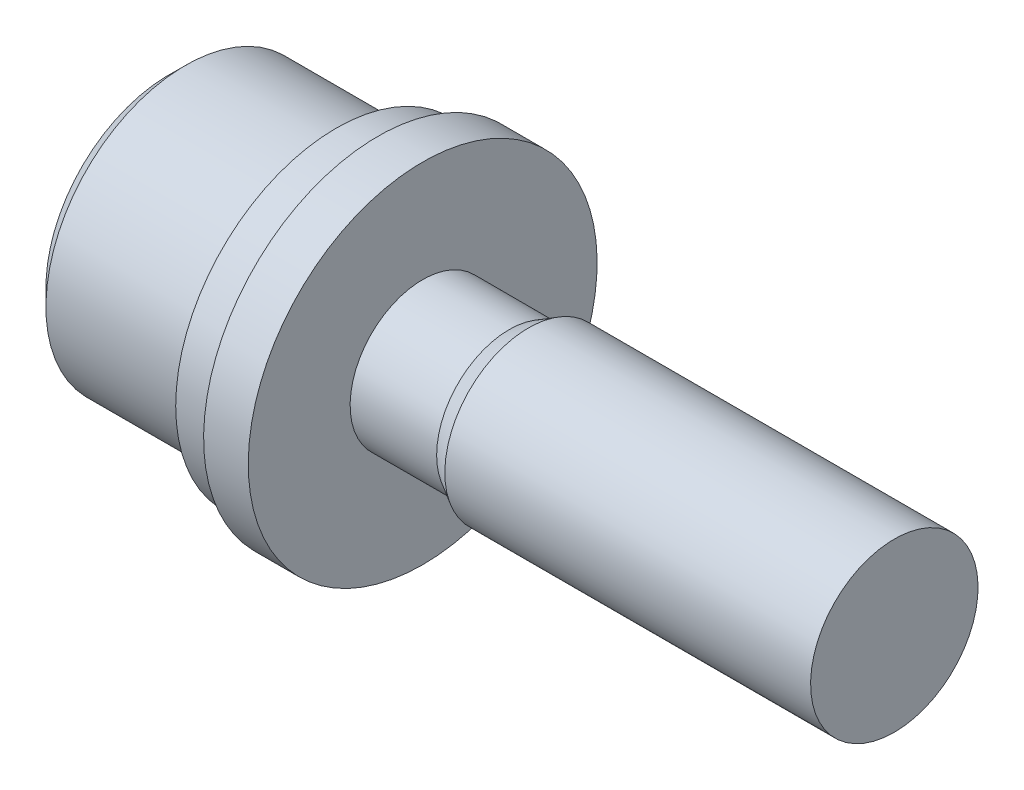
ISO-10303-21;
HEADER;
FILE_DESCRIPTION(('STEP AP214'),'2;1');
FILE_NAME('part.step','',(''),(''),'','','');
FILE_SCHEMA(('AUTOMOTIVE_DESIGN { 1 0 10303 214 1 1 1 1 }'));
ENDSEC;
DATA;
#1=APPLICATION_CONTEXT('core data for automotive mechanical design processes');
#2=APPLICATION_PROTOCOL_DEFINITION('international standard','automotive_design',2000,#1);
#3=PRODUCT_CONTEXT('',#1,'mechanical');
#4=PRODUCT('Part','Part','',(#3));
#5=PRODUCT_RELATED_PRODUCT_CATEGORY('part','',(#4));
#6=PRODUCT_DEFINITION_FORMATION('','',#4);
#7=PRODUCT_DEFINITION_CONTEXT('part definition',#1,'design');
#8=PRODUCT_DEFINITION('design','',#6,#7);
#9=PRODUCT_DEFINITION_SHAPE('','',#8);
#10=(LENGTH_UNIT() NAMED_UNIT(*) SI_UNIT(.MILLI.,.METRE.));
#11=(NAMED_UNIT(*) PLANE_ANGLE_UNIT() SI_UNIT($,.RADIAN.));
#12=(NAMED_UNIT(*) SI_UNIT($,.STERADIAN.) SOLID_ANGLE_UNIT());
#13=UNCERTAINTY_MEASURE_WITH_UNIT(LENGTH_MEASURE(1.E-05),#10,'distance_accuracy_value','');
#14=(GEOMETRIC_REPRESENTATION_CONTEXT(3) GLOBAL_UNCERTAINTY_ASSIGNED_CONTEXT((#13)) GLOBAL_UNIT_ASSIGNED_CONTEXT((#10,
#11,#12)) REPRESENTATION_CONTEXT('',''));
#15=CARTESIAN_POINT('',(0.,0.,0.));
#16=DIRECTION('',(0.,0.,1.));
#17=DIRECTION('',(1.,0.,0.));
#18=AXIS2_PLACEMENT_3D('',#15,#16,#17);
#19=CARTESIAN_POINT('',(-3.9,0.,0.));
#20=DIRECTION('',(-1.,0.,0.));
#21=DIRECTION('',(0.,0.,1.));
#22=AXIS2_PLACEMENT_3D('',#19,#20,#21);
#23=PLANE('',#22);
#24=DIRECTION('',(0.,-0.5,-0.866025403784438));
#25=VECTOR('',#24,1.);
#26=CARTESIAN_POINT('',(-3.9,2.1650635094611,-1.25));
#27=LINE('',#26,#25);
#28=CARTESIAN_POINT('',(-3.89999999999995,2.16506350946107,-1.24999999999999));
#29=VERTEX_POINT('',#28);
#30=CARTESIAN_POINT('',(-3.9,1.44337567297406,-2.5));
#31=VERTEX_POINT('',#30);
#32=EDGE_CURVE('E93',#29,#31,#27,.T.);
#33=ORIENTED_EDGE('',*,*,#32,.T.);
#34=DIRECTION('',(0.,1.,0.));
#35=VECTOR('',#34,1.);
#36=CARTESIAN_POINT('',(-3.9,0.,-2.5));
#37=LINE('',#36,#35);
#38=CARTESIAN_POINT('',(-3.89999999999995,0.,-2.49999999999997));
#39=VERTEX_POINT('',#38);
#40=EDGE_CURVE('E89',#31,#39,#37,.F.);
#41=ORIENTED_EDGE('',*,*,#40,.T.);
#42=CARTESIAN_POINT('',(-3.8999999999999,0.,0.));
#43=DIRECTION('',(-1.,0.,0.));
#44=DIRECTION('',(0.,0.,1.));
#45=AXIS2_PLACEMENT_3D('',#42,#43,#44);
#46=CIRCLE('',#45,2.49999999999995);
#47=EDGE_CURVE('E20',#39,#29,#46,.F.);
#48=ORIENTED_EDGE('',*,*,#47,.T.);
#49=EDGE_LOOP('',(#33,#41,#48));
#50=FACE_BOUND('',#49,.T.);
#51=ADVANCED_FACE('F17',(#50),#23,.T.);
#52=CARTESIAN_POINT('',(-3.9,0.,0.));
#53=DIRECTION('',(-1.,0.,0.));
#54=DIRECTION('',(0.,0.,1.));
#55=AXIS2_PLACEMENT_3D('',#52,#53,#54);
#56=PLANE('',#55);
#57=DIRECTION('',(0.,0.5,-0.866025403784439));
#58=VECTOR('',#57,1.);
#59=CARTESIAN_POINT('',(-3.9,2.1650635094611,1.25));
#60=LINE('',#59,#58);
#61=CARTESIAN_POINT('',(-3.89999999999995,2.16506350946107,1.24999999999999));
#62=VERTEX_POINT('',#61);
#63=CARTESIAN_POINT('',(-3.9,2.88675134594813,0.));
#64=VERTEX_POINT('',#63);
#65=EDGE_CURVE('E97',#62,#64,#60,.T.);
#66=ORIENTED_EDGE('',*,*,#65,.T.);
#67=DIRECTION('',(0.,-0.5,-0.866025403784439));
#68=VECTOR('',#67,1.);
#69=CARTESIAN_POINT('',(-3.9,2.88675134594813,0.));
#70=LINE('',#69,#68);
#71=EDGE_CURVE('E145',#64,#29,#70,.T.);
#72=ORIENTED_EDGE('',*,*,#71,.T.);
#73=CARTESIAN_POINT('',(-3.8999999999999,0.,0.));
#74=DIRECTION('',(-1.,0.,0.));
#75=DIRECTION('',(0.,0.,1.));
#76=AXIS2_PLACEMENT_3D('',#73,#74,#75);
#77=CIRCLE('',#76,2.49999999999995);
#78=EDGE_CURVE('E109',#29,#62,#77,.F.);
#79=ORIENTED_EDGE('',*,*,#78,.T.);
#80=EDGE_LOOP('',(#66,#72,#79));
#81=FACE_BOUND('',#80,.T.);
#82=ADVANCED_FACE('F197',(#81),#56,.T.);
#83=CARTESIAN_POINT('',(-3.9,0.,0.));
#84=DIRECTION('',(-1.,0.,0.));
#85=DIRECTION('',(0.,0.,1.));
#86=AXIS2_PLACEMENT_3D('',#83,#84,#85);
#87=PLANE('',#86);
#88=DIRECTION('',(0.,1.,0.));
#89=VECTOR('',#88,1.);
#90=CARTESIAN_POINT('',(-3.9,0.,2.5));
#91=LINE('',#90,#89);
#92=CARTESIAN_POINT('',(-3.89999999999996,0.,2.50000000000002));
#93=VERTEX_POINT('',#92);
#94=CARTESIAN_POINT('',(-3.9,1.44337567297406,2.5));
#95=VERTEX_POINT('',#94);
#96=EDGE_CURVE('E142',#93,#95,#91,.T.);
#97=ORIENTED_EDGE('',*,*,#96,.T.);
#98=DIRECTION('',(0.,0.5,-0.866025403784438));
#99=VECTOR('',#98,1.);
#100=CARTESIAN_POINT('',(-3.9,1.44337567297406,2.5));
#101=LINE('',#100,#99);
#102=EDGE_CURVE('E139',#95,#62,#101,.T.);
#103=ORIENTED_EDGE('',*,*,#102,.T.);
#104=CARTESIAN_POINT('',(-3.8999999999999,0.,0.));
#105=DIRECTION('',(-1.,0.,0.));
#106=DIRECTION('',(0.,0.,1.));
#107=AXIS2_PLACEMENT_3D('',#104,#105,#106);
#108=CIRCLE('',#107,2.49999999999995);
#109=EDGE_CURVE('E194',#62,#93,#108,.F.);
#110=ORIENTED_EDGE('',*,*,#109,.T.);
#111=EDGE_LOOP('',(#97,#103,#110));
#112=FACE_BOUND('',#111,.T.);
#113=ADVANCED_FACE('F199',(#112),#87,.T.);
#114=CARTESIAN_POINT('',(-3.9,0.,0.));
#115=DIRECTION('',(-1.,0.,0.));
#116=DIRECTION('',(0.,0.,1.));
#117=AXIS2_PLACEMENT_3D('',#114,#115,#116);
#118=PLANE('',#117);
#119=DIRECTION('',(0.,0.500000000000001,0.866025403784438));
#120=VECTOR('',#119,1.);
#121=CARTESIAN_POINT('',(-3.9,-2.1650635094611,1.25));
#122=LINE('',#121,#120);
#123=CARTESIAN_POINT('',(-3.89999999999995,-2.16506350946108,1.24999999999999));
#124=VERTEX_POINT('',#123);
#125=CARTESIAN_POINT('',(-3.9,-1.44337567297406,2.5));
#126=VERTEX_POINT('',#125);
#127=EDGE_CURVE('E136',#124,#126,#122,.T.);
#128=ORIENTED_EDGE('',*,*,#127,.T.);
#129=DIRECTION('',(0.,1.,0.));
#130=VECTOR('',#129,1.);
#131=CARTESIAN_POINT('',(-3.9,0.,2.5));
#132=LINE('',#131,#130);
#133=EDGE_CURVE('E133',#126,#93,#132,.T.);
#134=ORIENTED_EDGE('',*,*,#133,.T.);
#135=CARTESIAN_POINT('',(-3.8999999999999,0.,0.));
#136=DIRECTION('',(-1.,0.,0.));
#137=DIRECTION('',(0.,0.,1.));
#138=AXIS2_PLACEMENT_3D('',#135,#136,#137);
#139=CIRCLE('',#138,2.49999999999995);
#140=EDGE_CURVE('E191',#93,#124,#139,.F.);
#141=ORIENTED_EDGE('',*,*,#140,.T.);
#142=EDGE_LOOP('',(#128,#134,#141));
#143=FACE_BOUND('',#142,.T.);
#144=ADVANCED_FACE('F202',(#143),#118,.T.);
#145=CARTESIAN_POINT('',(-3.9,0.,0.));
#146=DIRECTION('',(-1.,0.,0.));
#147=DIRECTION('',(0.,0.,1.));
#148=AXIS2_PLACEMENT_3D('',#145,#146,#147);
#149=PLANE('',#148);
#150=DIRECTION('',(0.,-0.5,0.866025403784439));
#151=VECTOR('',#150,1.);
#152=CARTESIAN_POINT('',(-3.9,-2.1650635094611,-1.25));
#153=LINE('',#152,#151);
#154=CARTESIAN_POINT('',(-3.89999999999995,-2.16506350946107,-1.24999999999999));
#155=VERTEX_POINT('',#154);
#156=CARTESIAN_POINT('',(-3.9,-2.88675134594813,0.));
#157=VERTEX_POINT('',#156);
#158=EDGE_CURVE('E130',#155,#157,#153,.T.);
#159=ORIENTED_EDGE('',*,*,#158,.T.);
#160=DIRECTION('',(0.,0.499999999999999,0.866025403784439));
#161=VECTOR('',#160,1.);
#162=CARTESIAN_POINT('',(-3.9,-2.88675134594813,0.));
#163=LINE('',#162,#161);
#164=EDGE_CURVE('E110',#157,#124,#163,.T.);
#165=ORIENTED_EDGE('',*,*,#164,.T.);
#166=CARTESIAN_POINT('',(-3.8999999999999,0.,0.));
#167=DIRECTION('',(-1.,0.,0.));
#168=DIRECTION('',(0.,0.,1.));
#169=AXIS2_PLACEMENT_3D('',#166,#167,#168);
#170=CIRCLE('',#169,2.49999999999995);
#171=EDGE_CURVE('E117',#124,#155,#170,.F.);
#172=ORIENTED_EDGE('',*,*,#171,.T.);
#173=EDGE_LOOP('',(#159,#165,#172));
#174=FACE_BOUND('',#173,.T.);
#175=ADVANCED_FACE('F204',(#174),#149,.T.);
#176=CARTESIAN_POINT('',(-3.8999999999999,0.,0.));
#177=DIRECTION('',(-1.,0.,0.));
#178=DIRECTION('',(0.,0.,1.));
#179=AXIS2_PLACEMENT_3D('',#176,#177,#178);
#180=CONICAL_SURFACE('',#179,2.49999999999995,1.0471975511966);
#181=CARTESIAN_POINT('',(-2.45662432702587,0.,0.));
#182=VERTEX_POINT('',#181);
#183=VERTEX_LOOP('',#182);
#184=FACE_BOUND('',#183,.T.);
#185=ORIENTED_EDGE('',*,*,#47,.F.);
#186=CARTESIAN_POINT('',(-3.8999999999999,0.,0.));
#187=DIRECTION('',(-1.,0.,0.));
#188=DIRECTION('',(0.,0.,1.));
#189=AXIS2_PLACEMENT_3D('',#186,#187,#188);
#190=CIRCLE('',#189,2.49999999999995);
#191=EDGE_CURVE('E105',#155,#39,#190,.F.);
#192=ORIENTED_EDGE('',*,*,#191,.F.);
#193=ORIENTED_EDGE('',*,*,#171,.F.);
#194=ORIENTED_EDGE('',*,*,#140,.F.);
#195=ORIENTED_EDGE('',*,*,#109,.F.);
#196=ORIENTED_EDGE('',*,*,#78,.F.);
#197=EDGE_LOOP('',(#185,#192,#193,#194,#195,#196));
#198=FACE_BOUND('',#197,.T.);
#199=ADVANCED_FACE('F103',(#184,#198),#180,.F.);
#200=CARTESIAN_POINT('',(-3.9,0.,0.));
#201=DIRECTION('',(-1.,0.,0.));
#202=DIRECTION('',(0.,0.,1.));
#203=AXIS2_PLACEMENT_3D('',#200,#201,#202);
#204=PLANE('',#203);
#205=DIRECTION('',(0.,1.,0.));
#206=VECTOR('',#205,1.);
#207=CARTESIAN_POINT('',(-3.9,1.44337567297406,-2.5));
#208=LINE('',#207,#206);
#209=CARTESIAN_POINT('',(-3.9,-1.44337567297406,-2.5));
#210=VERTEX_POINT('',#209);
#211=EDGE_CURVE('E114',#39,#210,#208,.F.);
#212=ORIENTED_EDGE('',*,*,#211,.T.);
#213=DIRECTION('',(0.,-0.5,0.866025403784439));
#214=VECTOR('',#213,1.);
#215=CARTESIAN_POINT('',(-3.9,-1.44337567297406,-2.5));
#216=LINE('',#215,#214);
#217=EDGE_CURVE('E116',#210,#155,#216,.T.);
#218=ORIENTED_EDGE('',*,*,#217,.T.);
#219=ORIENTED_EDGE('',*,*,#191,.T.);
#220=EDGE_LOOP('',(#212,#218,#219));
#221=FACE_BOUND('',#220,.T.);
#222=ADVANCED_FACE('F113',(#221),#204,.T.);
#223=CARTESIAN_POINT('',(-3.9,1.44337567297406,-2.5));
#224=DIRECTION('',(0.,0.,-1.));
#225=DIRECTION('',(-1.,0.,0.));
#226=AXIS2_PLACEMENT_3D('',#223,#224,#225);
#227=PLANE('',#226);
#228=DIRECTION('',(1.,0.,0.));
#229=VECTOR('',#228,1.);
#230=CARTESIAN_POINT('',(-3.9,-1.44337567297406,-2.5));
#231=LINE('',#230,#229);
#232=CARTESIAN_POINT('',(-9.1,-1.44337567297406,-2.5));
#233=VERTEX_POINT('',#232);
#234=EDGE_CURVE('E121',#233,#210,#231,.T.);
#235=ORIENTED_EDGE('',*,*,#234,.T.);
#236=ORIENTED_EDGE('',*,*,#211,.F.);
#237=ORIENTED_EDGE('',*,*,#40,.F.);
#238=DIRECTION('',(1.,0.,0.));
#239=VECTOR('',#238,1.);
#240=CARTESIAN_POINT('',(-3.9,1.44337567297406,-2.5));
#241=LINE('',#240,#239);
#242=CARTESIAN_POINT('',(-9.1,1.44337567297406,-2.5));
#243=VERTEX_POINT('',#242);
#244=EDGE_CURVE('E160',#31,#243,#241,.F.);
#245=ORIENTED_EDGE('',*,*,#244,.T.);
#246=DIRECTION('',(0.,1.,0.));
#247=VECTOR('',#246,1.);
#248=CARTESIAN_POINT('',(-9.1,5.,-2.5));
#249=LINE('',#248,#247);
#250=EDGE_CURVE('E162',#243,#233,#249,.F.);
#251=ORIENTED_EDGE('',*,*,#250,.T.);
#252=EDGE_LOOP('',(#235,#236,#237,#245,#251));
#253=FACE_BOUND('',#252,.T.);
#254=ADVANCED_FACE('F119',(#253),#227,.F.);
#255=CARTESIAN_POINT('',(-3.9,-1.44337567297406,-2.5));
#256=DIRECTION('',(0.,-0.866025403784439,-0.5));
#257=DIRECTION('',(0.,0.5,-0.866025403784439));
#258=AXIS2_PLACEMENT_3D('',#255,#256,#257);
#259=PLANE('',#258);
#260=DIRECTION('',(1.,0.,0.));
#261=VECTOR('',#260,1.);
#262=CARTESIAN_POINT('',(-3.9,-2.88675134594813,0.));
#263=LINE('',#262,#261);
#264=CARTESIAN_POINT('',(-9.1,-2.88675134594813,0.));
#265=VERTEX_POINT('',#264);
#266=EDGE_CURVE('E123',#265,#157,#263,.T.);
#267=ORIENTED_EDGE('',*,*,#266,.T.);
#268=ORIENTED_EDGE('',*,*,#158,.F.);
#269=ORIENTED_EDGE('',*,*,#217,.F.);
#270=ORIENTED_EDGE('',*,*,#234,.F.);
#271=DIRECTION('',(0.,-0.5,0.866025403784439));
#272=VECTOR('',#271,1.);
#273=CARTESIAN_POINT('',(-9.1,-1.44337567297406,-2.5));
#274=LINE('',#273,#272);
#275=EDGE_CURVE('E212',#233,#265,#274,.T.);
#276=ORIENTED_EDGE('',*,*,#275,.T.);
#277=EDGE_LOOP('',(#267,#268,#269,#270,#276));
#278=FACE_BOUND('',#277,.T.);
#279=ADVANCED_FACE('F210',(#278),#259,.F.);
#280=CARTESIAN_POINT('',(-3.9,-2.88675134594813,0.));
#281=DIRECTION('',(0.,-0.866025403784439,0.5));
#282=DIRECTION('',(0.,-0.5,-0.866025403784439));
#283=AXIS2_PLACEMENT_3D('',#280,#281,#282);
#284=PLANE('',#283);
#285=DIRECTION('',(1.,0.,0.));
#286=VECTOR('',#285,1.);
#287=CARTESIAN_POINT('',(-3.9,-1.44337567297406,2.5));
#288=LINE('',#287,#286);
#289=CARTESIAN_POINT('',(-9.1,-1.44337567297406,2.5));
#290=VERTEX_POINT('',#289);
#291=EDGE_CURVE('E152',#290,#126,#288,.T.);
#292=ORIENTED_EDGE('',*,*,#291,.T.);
#293=ORIENTED_EDGE('',*,*,#127,.F.);
#294=ORIENTED_EDGE('',*,*,#164,.F.);
#295=ORIENTED_EDGE('',*,*,#266,.F.);
#296=DIRECTION('',(0.,0.5,0.866025403784439));
#297=VECTOR('',#296,1.);
#298=CARTESIAN_POINT('',(-9.1,-2.88675134594813,0.));
#299=LINE('',#298,#297);
#300=EDGE_CURVE('E215',#265,#290,#299,.T.);
#301=ORIENTED_EDGE('',*,*,#300,.T.);
#302=EDGE_LOOP('',(#292,#293,#294,#295,#301));
#303=FACE_BOUND('',#302,.T.);
#304=ADVANCED_FACE('F207',(#303),#284,.F.);
#305=CARTESIAN_POINT('',(-3.9,-1.44337567297406,2.5));
#306=DIRECTION('',(0.,0.,1.));
#307=DIRECTION('',(1.,0.,0.));
#308=AXIS2_PLACEMENT_3D('',#305,#306,#307);
#309=PLANE('',#308);
#310=DIRECTION('',(1.,0.,0.));
#311=VECTOR('',#310,1.);
#312=CARTESIAN_POINT('',(-3.9,1.44337567297406,2.5));
#313=LINE('',#312,#311);
#314=CARTESIAN_POINT('',(-9.1,1.44337567297406,2.5));
#315=VERTEX_POINT('',#314);
#316=EDGE_CURVE('E155',#315,#95,#313,.T.);
#317=ORIENTED_EDGE('',*,*,#316,.T.);
#318=ORIENTED_EDGE('',*,*,#96,.F.);
#319=ORIENTED_EDGE('',*,*,#133,.F.);
#320=ORIENTED_EDGE('',*,*,#291,.F.);
#321=DIRECTION('',(0.,1.,0.));
#322=VECTOR('',#321,1.);
#323=CARTESIAN_POINT('',(-9.1,5.,2.5));
#324=LINE('',#323,#322);
#325=EDGE_CURVE('E217',#290,#315,#324,.T.);
#326=ORIENTED_EDGE('',*,*,#325,.T.);
#327=EDGE_LOOP('',(#317,#318,#319,#320,#326));
#328=FACE_BOUND('',#327,.T.);
#329=ADVANCED_FACE('F369',(#328),#309,.F.);
#330=CARTESIAN_POINT('',(-3.9,1.44337567297406,2.5));
#331=DIRECTION('',(0.,0.866025403784439,0.5));
#332=DIRECTION('',(0.,-0.5,0.866025403784439));
#333=AXIS2_PLACEMENT_3D('',#330,#331,#332);
#334=PLANE('',#333);
#335=DIRECTION('',(1.,0.,0.));
#336=VECTOR('',#335,1.);
#337=CARTESIAN_POINT('',(-3.9,2.88675134594813,0.));
#338=LINE('',#337,#336);
#339=CARTESIAN_POINT('',(-9.1,2.88675134594813,0.));
#340=VERTEX_POINT('',#339);
#341=EDGE_CURVE('E158',#340,#64,#338,.T.);
#342=ORIENTED_EDGE('',*,*,#341,.T.);
#343=ORIENTED_EDGE('',*,*,#65,.F.);
#344=ORIENTED_EDGE('',*,*,#102,.F.);
#345=ORIENTED_EDGE('',*,*,#316,.F.);
#346=DIRECTION('',(0.,0.5,-0.866025403784439));
#347=VECTOR('',#346,1.);
#348=CARTESIAN_POINT('',(-9.1,1.44337567297406,2.5));
#349=LINE('',#348,#347);
#350=EDGE_CURVE('E35',#315,#340,#349,.T.);
#351=ORIENTED_EDGE('',*,*,#350,.T.);
#352=EDGE_LOOP('',(#342,#343,#344,#345,#351));
#353=FACE_BOUND('',#352,.T.);
#354=ADVANCED_FACE('F359',(#353),#334,.F.);
#355=CARTESIAN_POINT('',(-3.9,2.88675134594813,0.));
#356=DIRECTION('',(0.,0.866025403784439,-0.5));
#357=DIRECTION('',(0.,0.5,0.866025403784439));
#358=AXIS2_PLACEMENT_3D('',#355,#356,#357);
#359=PLANE('',#358);
#360=ORIENTED_EDGE('',*,*,#244,.F.);
#361=ORIENTED_EDGE('',*,*,#32,.F.);
#362=ORIENTED_EDGE('',*,*,#71,.F.);
#363=ORIENTED_EDGE('',*,*,#341,.F.);
#364=DIRECTION('',(0.,-0.5,-0.866025403784439));
#365=VECTOR('',#364,1.);
#366=CARTESIAN_POINT('',(-9.1,2.88675134594813,0.));
#367=LINE('',#366,#365);
#368=EDGE_CURVE('E187',#340,#243,#367,.T.);
#369=ORIENTED_EDGE('',*,*,#368,.T.);
#370=EDGE_LOOP('',(#360,#361,#362,#363,#369));
#371=FACE_BOUND('',#370,.T.);
#372=ADVANCED_FACE('F350',(#371),#359,.F.);
#373=CARTESIAN_POINT('',(-9.1,5.,0.));
#374=DIRECTION('',(1.,0.,0.));
#375=DIRECTION('',(0.,1.,0.));
#376=AXIS2_PLACEMENT_3D('',#373,#374,#375);
#377=PLANE('',#376);
#378=ORIENTED_EDGE('',*,*,#350,.F.);
#379=ORIENTED_EDGE('',*,*,#325,.F.);
#380=ORIENTED_EDGE('',*,*,#300,.F.);
#381=ORIENTED_EDGE('',*,*,#275,.F.);
#382=ORIENTED_EDGE('',*,*,#250,.F.);
#383=ORIENTED_EDGE('',*,*,#368,.F.);
#384=EDGE_LOOP('',(#378,#379,#380,#381,#382,#383));
#385=FACE_BOUND('',#384,.T.);
#386=CARTESIAN_POINT('',(-9.09999999998945,0.,0.));
#387=DIRECTION('',(1.,0.,0.));
#388=DIRECTION('',(0.,0.,-1.));
#389=AXIS2_PLACEMENT_3D('',#386,#387,#388);
#390=CIRCLE('',#389,4.39999999997553);
#391=CARTESIAN_POINT('',(-9.09999999998945,0.,-4.39999999997553));
#392=VERTEX_POINT('',#391);
#393=EDGE_CURVE('E185',#392,#392,#390,.T.);
#394=ORIENTED_EDGE('',*,*,#393,.F.);
#395=EDGE_LOOP('',(#394));
#396=FACE_BOUND('',#395,.T.);
#397=ADVANCED_FACE('F340',(#385,#396),#377,.F.);
#398=CARTESIAN_POINT('',(-8.50000000002638,0.,0.));
#399=DIRECTION('',(1.,0.,0.));
#400=DIRECTION('',(0.,0.,-1.));
#401=AXIS2_PLACEMENT_3D('',#398,#399,#400);
#402=CONICAL_SURFACE('',#401,4.99999999993861,0.785398163397448);
#403=CARTESIAN_POINT('',(-8.49999999999999,0.,0.));
#404=DIRECTION('',(-1.,0.,0.));
#405=DIRECTION('',(0.,-1.,0.));
#406=AXIS2_PLACEMENT_3D('',#403,#404,#405);
#407=CIRCLE('',#406,5.);
#408=CARTESIAN_POINT('',(-8.49999999999999,-5.,0.));
#409=VERTEX_POINT('',#408);
#410=EDGE_CURVE('E184',#409,#409,#407,.F.);
#411=ORIENTED_EDGE('',*,*,#410,.F.);
#412=EDGE_LOOP('',(#411));
#413=FACE_BOUND('',#412,.T.);
#414=ORIENTED_EDGE('',*,*,#393,.T.);
#415=EDGE_LOOP('',(#414));
#416=FACE_BOUND('',#415,.T.);
#417=ADVANCED_FACE('F330',(#413,#416),#402,.T.);
#418=CARTESIAN_POINT('',(-9.1,0.,0.));
#419=DIRECTION('',(-1.,0.,0.));
#420=DIRECTION('',(0.,-1.,0.));
#421=AXIS2_PLACEMENT_3D('',#418,#419,#420);
#422=CYLINDRICAL_SURFACE('',#421,5.);
#423=ORIENTED_EDGE('',*,*,#410,.T.);
#424=EDGE_LOOP('',(#423));
#425=FACE_BOUND('',#424,.T.);
#426=CARTESIAN_POINT('',(-3.1,0.,0.));
#427=DIRECTION('',(-1.,0.,0.));
#428=DIRECTION('',(0.,-1.,0.));
#429=AXIS2_PLACEMENT_3D('',#426,#427,#428);
#430=CIRCLE('',#429,5.);
#431=CARTESIAN_POINT('',(-3.1,-5.,0.));
#432=VERTEX_POINT('',#431);
#433=EDGE_CURVE('E181',#432,#432,#430,.T.);
#434=ORIENTED_EDGE('',*,*,#433,.T.);
#435=EDGE_LOOP('',(#434));
#436=FACE_BOUND('',#435,.T.);
#437=ADVANCED_FACE('F320',(#425,#436),#422,.T.);
#438=CARTESIAN_POINT('',(-3.1,5.75,0.));
#439=DIRECTION('',(1.,0.,0.));
#440=DIRECTION('',(0.,1.,0.));
#441=AXIS2_PLACEMENT_3D('',#438,#439,#440);
#442=PLANE('',#441);
#443=CARTESIAN_POINT('',(-3.1,0.,0.));
#444=DIRECTION('',(-1.,0.,0.));
#445=DIRECTION('',(0.,-1.,0.));
#446=AXIS2_PLACEMENT_3D('',#443,#444,#445);
#447=CIRCLE('',#446,5.75);
#448=CARTESIAN_POINT('',(-3.1,-5.75,0.));
#449=VERTEX_POINT('',#448);
#450=EDGE_CURVE('E178',#449,#449,#447,.F.);
#451=ORIENTED_EDGE('',*,*,#450,.F.);
#452=EDGE_LOOP('',(#451));
#453=FACE_BOUND('',#452,.T.);
#454=ORIENTED_EDGE('',*,*,#433,.F.);
#455=EDGE_LOOP('',(#454));
#456=FACE_BOUND('',#455,.T.);
#457=ADVANCED_FACE('F310',(#453,#456),#442,.F.);
#458=CARTESIAN_POINT('',(-9.1,0.,0.));
#459=DIRECTION('',(-1.,0.,0.));
#460=DIRECTION('',(0.,-1.,0.));
#461=AXIS2_PLACEMENT_3D('',#458,#459,#460);
#462=CYLINDRICAL_SURFACE('',#461,5.75);
#463=ORIENTED_EDGE('',*,*,#450,.T.);
#464=EDGE_LOOP('',(#463));
#465=FACE_BOUND('',#464,.T.);
#466=CARTESIAN_POINT('',(-1.6,0.,0.));
#467=DIRECTION('',(-1.,0.,0.));
#468=DIRECTION('',(0.,-1.,0.));
#469=AXIS2_PLACEMENT_3D('',#466,#467,#468);
#470=CIRCLE('',#469,5.75);
#471=CARTESIAN_POINT('',(-1.6,-5.75,0.));
#472=VERTEX_POINT('',#471);
#473=EDGE_CURVE('E175',#472,#472,#470,.T.);
#474=ORIENTED_EDGE('',*,*,#473,.T.);
#475=EDGE_LOOP('',(#474));
#476=FACE_BOUND('',#475,.T.);
#477=ADVANCED_FACE('F300',(#465,#476),#462,.T.);
#478=CARTESIAN_POINT('',(-1.6,5.75,0.));
#479=DIRECTION('',(1.,0.,0.));
#480=DIRECTION('',(0.,1.,0.));
#481=AXIS2_PLACEMENT_3D('',#478,#479,#480);
#482=PLANE('',#481);
#483=CARTESIAN_POINT('',(-1.6,0.,0.));
#484=DIRECTION('',(-1.,0.,0.));
#485=DIRECTION('',(0.,-1.,0.));
#486=AXIS2_PLACEMENT_3D('',#483,#484,#485);
#487=CIRCLE('',#486,6.25);
#488=CARTESIAN_POINT('',(-1.6,-6.25,0.));
#489=VERTEX_POINT('',#488);
#490=EDGE_CURVE('E172',#489,#489,#487,.F.);
#491=ORIENTED_EDGE('',*,*,#490,.F.);
#492=EDGE_LOOP('',(#491));
#493=FACE_BOUND('',#492,.T.);
#494=ORIENTED_EDGE('',*,*,#473,.F.);
#495=EDGE_LOOP('',(#494));
#496=FACE_BOUND('',#495,.T.);
#497=ADVANCED_FACE('F290',(#493,#496),#482,.F.);
#498=CARTESIAN_POINT('',(-9.1,0.,0.));
#499=DIRECTION('',(-1.,0.,0.));
#500=DIRECTION('',(0.,-1.,0.));
#501=AXIS2_PLACEMENT_3D('',#498,#499,#500);
#502=CYLINDRICAL_SURFACE('',#501,6.25);
#503=ORIENTED_EDGE('',*,*,#490,.T.);
#504=EDGE_LOOP('',(#503));
#505=FACE_BOUND('',#504,.T.);
#506=CARTESIAN_POINT('',(0.,0.,0.));
#507=DIRECTION('',(-1.,0.,0.));
#508=DIRECTION('',(0.,-1.,0.));
#509=AXIS2_PLACEMENT_3D('',#506,#507,#508);
#510=CIRCLE('',#509,6.25);
#511=CARTESIAN_POINT('',(0.,-6.25,0.));
#512=VERTEX_POINT('',#511);
#513=EDGE_CURVE('E169',#512,#512,#510,.T.);
#514=ORIENTED_EDGE('',*,*,#513,.T.);
#515=EDGE_LOOP('',(#514));
#516=FACE_BOUND('',#515,.T.);
#517=ADVANCED_FACE('F244',(#505,#516),#502,.T.);
#518=CARTESIAN_POINT('',(0.,2.6,0.));
#519=DIRECTION('',(-1.,0.,0.));
#520=DIRECTION('',(0.,-1.,0.));
#521=AXIS2_PLACEMENT_3D('',#518,#519,#520);
#522=PLANE('',#521);
#523=CARTESIAN_POINT('',(0.,0.,0.));
#524=DIRECTION('',(-1.,0.,0.));
#525=DIRECTION('',(0.,-1.,0.));
#526=AXIS2_PLACEMENT_3D('',#523,#524,#525);
#527=CIRCLE('',#526,2.6);
#528=CARTESIAN_POINT('',(0.,-2.6,0.));
#529=VERTEX_POINT('',#528);
#530=EDGE_CURVE('E166',#529,#529,#527,.F.);
#531=ORIENTED_EDGE('',*,*,#530,.F.);
#532=EDGE_LOOP('',(#531));
#533=FACE_BOUND('',#532,.T.);
#534=ORIENTED_EDGE('',*,*,#513,.F.);
#535=EDGE_LOOP('',(#534));
#536=FACE_BOUND('',#535,.T.);
#537=ADVANCED_FACE('F234',(#533,#536),#522,.F.);
#538=CARTESIAN_POINT('',(-9.1,0.,0.));
#539=DIRECTION('',(-1.,0.,0.));
#540=DIRECTION('',(0.,-1.,0.));
#541=AXIS2_PLACEMENT_3D('',#538,#539,#540);
#542=CYLINDRICAL_SURFACE('',#541,2.6);
#543=ORIENTED_EDGE('',*,*,#530,.T.);
#544=EDGE_LOOP('',(#543));
#545=FACE_BOUND('',#544,.T.);
#546=CARTESIAN_POINT('',(3.0999999999608,0.,0.));
#547=DIRECTION('',(1.,0.,0.));
#548=DIRECTION('',(0.,1.,0.));
#549=AXIS2_PLACEMENT_3D('',#546,#547,#548);
#550=CIRCLE('',#549,2.59999999997262);
#551=CARTESIAN_POINT('',(3.0999999999608,2.59999999997262,0.));
#552=VERTEX_POINT('',#551);
#553=EDGE_CURVE('E165',#552,#552,#550,.T.);
#554=ORIENTED_EDGE('',*,*,#553,.F.);
#555=EDGE_LOOP('',(#554));
#556=FACE_BOUND('',#555,.T.);
#557=ADVANCED_FACE('F231',(#545,#556),#542,.T.);
#558=CARTESIAN_POINT('',(16.9,3.,0.));
#559=DIRECTION('',(-1.,0.,0.));
#560=DIRECTION('',(0.,-1.,0.));
#561=AXIS2_PLACEMENT_3D('',#558,#559,#560);
#562=PLANE('',#561);
#563=CARTESIAN_POINT('',(16.9,0.,0.));
#564=DIRECTION('',(-1.,0.,0.));
#565=DIRECTION('',(0.,-1.,0.));
#566=AXIS2_PLACEMENT_3D('',#563,#564,#565);
#567=CIRCLE('',#566,3.);
#568=CARTESIAN_POINT('',(16.9,-3.,0.));
#569=VERTEX_POINT('',#568);
#570=EDGE_CURVE('E26',#569,#569,#567,.T.);
#571=ORIENTED_EDGE('',*,*,#570,.F.);
#572=EDGE_LOOP('',(#571));
#573=FACE_BOUND('',#572,.T.);
#574=ADVANCED_FACE('F233',(#573),#562,.F.);
#575=CARTESIAN_POINT('',(3.79282032298534,0.,0.));
#576=DIRECTION('',(1.,0.,0.));
#577=DIRECTION('',(0.,0.,-1.));
#578=AXIS2_PLACEMENT_3D('',#575,#576,#577);
#579=CONICAL_SURFACE('',#578,2.9999999999859,0.523598775614559);
#580=CARTESIAN_POINT('',(3.79282032302756,0.,0.));
#581=DIRECTION('',(-1.,0.,0.));
#582=DIRECTION('',(0.,-1.,0.));
#583=AXIS2_PLACEMENT_3D('',#580,#581,#582);
#584=CIRCLE('',#583,3.);
#585=CARTESIAN_POINT('',(3.79282032302756,-3.,0.));
#586=VERTEX_POINT('',#585);
#587=EDGE_CURVE('E10',#586,#586,#584,.F.);
#588=ORIENTED_EDGE('',*,*,#587,.F.);
#589=EDGE_LOOP('',(#588));
#590=FACE_BOUND('',#589,.T.);
#591=ORIENTED_EDGE('',*,*,#553,.T.);
#592=EDGE_LOOP('',(#591));
#593=FACE_BOUND('',#592,.T.);
#594=ADVANCED_FACE('F229',(#590,#593),#579,.T.);
#595=CARTESIAN_POINT('',(-9.1,0.,0.));
#596=DIRECTION('',(-1.,0.,0.));
#597=DIRECTION('',(0.,-1.,0.));
#598=AXIS2_PLACEMENT_3D('',#595,#596,#597);
#599=CYLINDRICAL_SURFACE('',#598,3.);
#600=ORIENTED_EDGE('',*,*,#587,.T.);
#601=EDGE_LOOP('',(#600));
#602=FACE_BOUND('',#601,.T.);
#603=ORIENTED_EDGE('',*,*,#570,.T.);
#604=EDGE_LOOP('',(#603));
#605=FACE_BOUND('',#604,.T.);
#606=ADVANCED_FACE('F247',(#602,#605),#599,.T.);
#607=CLOSED_SHELL('',(#51,#82,#113,#144,#175,#199,#222,#254,#279,#304,#329,#354,#372,#397,#417,
#437,#457,#477,#497,#517,#537,#557,#574,#594,#606));
#608=MANIFOLD_SOLID_BREP('B1',#607);
#609=ADVANCED_BREP_SHAPE_REPRESENTATION('',(#18,#608),#14);
#610=SHAPE_DEFINITION_REPRESENTATION(#9,#609);
ENDSEC;
END-ISO-10303-21;
